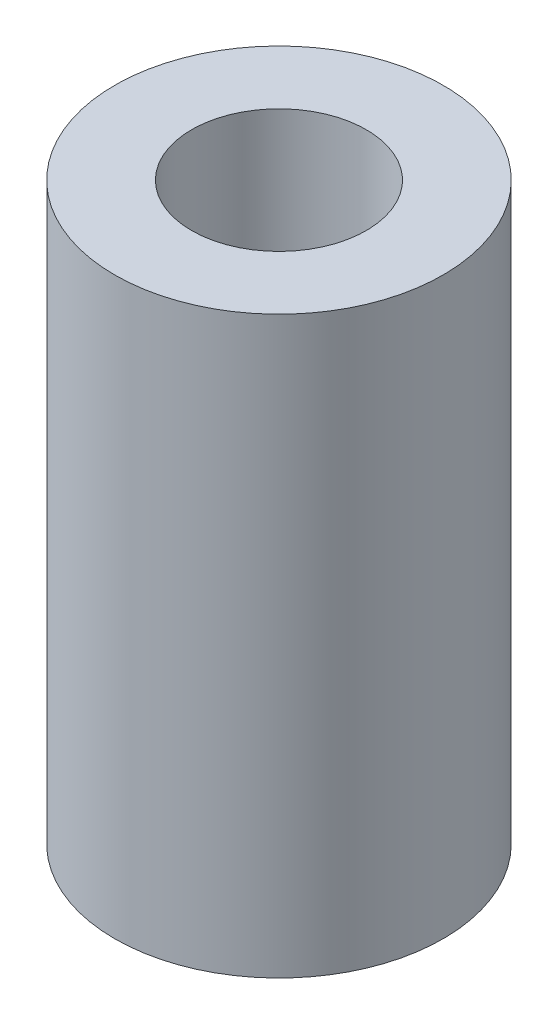
ISO-10303-21;
HEADER;
FILE_DESCRIPTION(('STEP AP214'),'2;1');
FILE_NAME('part.step','',(''),(''),'','','');
FILE_SCHEMA(('AUTOMOTIVE_DESIGN { 1 0 10303 214 1 1 1 1 }'));
ENDSEC;
DATA;
#1=APPLICATION_CONTEXT('core data for automotive mechanical design processes');
#2=APPLICATION_PROTOCOL_DEFINITION('international standard','automotive_design',2000,#1);
#3=PRODUCT_CONTEXT('',#1,'mechanical');
#4=PRODUCT('Part','Part','',(#3));
#5=PRODUCT_RELATED_PRODUCT_CATEGORY('part','',(#4));
#6=PRODUCT_DEFINITION_FORMATION('','',#4);
#7=PRODUCT_DEFINITION_CONTEXT('part definition',#1,'design');
#8=PRODUCT_DEFINITION('design','',#6,#7);
#9=PRODUCT_DEFINITION_SHAPE('','',#8);
#10=(LENGTH_UNIT() NAMED_UNIT(*) SI_UNIT(.MILLI.,.METRE.));
#11=(NAMED_UNIT(*) PLANE_ANGLE_UNIT() SI_UNIT($,.RADIAN.));
#12=(NAMED_UNIT(*) SI_UNIT($,.STERADIAN.) SOLID_ANGLE_UNIT());
#13=UNCERTAINTY_MEASURE_WITH_UNIT(LENGTH_MEASURE(1.E-05),#10,'distance_accuracy_value','');
#14=(GEOMETRIC_REPRESENTATION_CONTEXT(3) GLOBAL_UNCERTAINTY_ASSIGNED_CONTEXT((#13)) GLOBAL_UNIT_ASSIGNED_CONTEXT((#10,
#11,#12)) REPRESENTATION_CONTEXT('',''));
#15=CARTESIAN_POINT('',(0.,0.,0.));
#16=DIRECTION('',(0.,0.,1.));
#17=DIRECTION('',(1.,0.,0.));
#18=AXIS2_PLACEMENT_3D('',#15,#16,#17);
#19=CARTESIAN_POINT('',(0.,22.225,0.));
#20=DIRECTION('',(0.,1.,0.));
#21=DIRECTION('',(0.,0.,1.));
#22=AXIS2_PLACEMENT_3D('',#19,#20,#21);
#23=PLANE('',#22);
#24=CARTESIAN_POINT('',(0.,22.225,0.));
#25=DIRECTION('',(0.,1.,0.));
#26=DIRECTION('',(0.,0.,1.));
#27=AXIS2_PLACEMENT_3D('',#24,#25,#26);
#28=CIRCLE('',#27,6.35);
#29=CARTESIAN_POINT('',(0.,22.225,6.35));
#30=VERTEX_POINT('',#29);
#31=EDGE_CURVE('E10',#30,#30,#28,.T.);
#32=ORIENTED_EDGE('',*,*,#31,.T.);
#33=EDGE_LOOP('',(#32));
#34=FACE_BOUND('',#33,.T.);
#35=CARTESIAN_POINT('',(0.,22.225,0.));
#36=DIRECTION('',(0.,1.,0.));
#37=DIRECTION('',(0.,0.,1.));
#38=AXIS2_PLACEMENT_3D('',#35,#36,#37);
#39=CIRCLE('',#38,3.3782);
#40=CARTESIAN_POINT('',(0.,22.225,3.3782));
#41=VERTEX_POINT('',#40);
#42=EDGE_CURVE('E41',#41,#41,#39,.T.);
#43=ORIENTED_EDGE('',*,*,#42,.F.);
#44=EDGE_LOOP('',(#43));
#45=FACE_BOUND('',#44,.T.);
#46=ADVANCED_FACE('F30',(#34,#45),#23,.T.);
#47=CARTESIAN_POINT('',(0.,0.,0.));
#48=DIRECTION('',(0.,1.,0.));
#49=DIRECTION('',(0.,0.,1.));
#50=AXIS2_PLACEMENT_3D('',#47,#48,#49);
#51=PLANE('',#50);
#52=CARTESIAN_POINT('',(0.,0.,0.));
#53=DIRECTION('',(0.,1.,0.));
#54=DIRECTION('',(0.,0.,1.));
#55=AXIS2_PLACEMENT_3D('',#52,#53,#54);
#56=CIRCLE('',#55,6.35);
#57=CARTESIAN_POINT('',(0.,0.,6.35));
#58=VERTEX_POINT('',#57);
#59=EDGE_CURVE('E34',#58,#58,#56,.T.);
#60=ORIENTED_EDGE('',*,*,#59,.F.);
#61=EDGE_LOOP('',(#60));
#62=FACE_BOUND('',#61,.T.);
#63=CARTESIAN_POINT('',(0.,0.,0.));
#64=DIRECTION('',(0.,1.,0.));
#65=DIRECTION('',(0.,0.,1.));
#66=AXIS2_PLACEMENT_3D('',#63,#64,#65);
#67=CIRCLE('',#66,3.3782);
#68=CARTESIAN_POINT('',(0.,0.,3.3782));
#69=VERTEX_POINT('',#68);
#70=EDGE_CURVE('E43',#69,#69,#67,.T.);
#71=ORIENTED_EDGE('',*,*,#70,.T.);
#72=EDGE_LOOP('',(#71));
#73=FACE_BOUND('',#72,.T.);
#74=ADVANCED_FACE('F53',(#62,#73),#51,.F.);
#75=CARTESIAN_POINT('',(0.,22.225,0.));
#76=DIRECTION('',(0.,-1.,0.));
#77=DIRECTION('',(0.,0.,-1.));
#78=AXIS2_PLACEMENT_3D('',#75,#76,#77);
#79=CYLINDRICAL_SURFACE('',#78,6.35);
#80=ORIENTED_EDGE('',*,*,#31,.F.);
#81=EDGE_LOOP('',(#80));
#82=FACE_BOUND('',#81,.T.);
#83=ORIENTED_EDGE('',*,*,#59,.T.);
#84=EDGE_LOOP('',(#83));
#85=FACE_BOUND('',#84,.T.);
#86=ADVANCED_FACE('F32',(#82,#85),#79,.T.);
#87=CARTESIAN_POINT('',(0.,22.225,0.));
#88=DIRECTION('',(0.,-1.,0.));
#89=DIRECTION('',(0.,0.,-1.));
#90=AXIS2_PLACEMENT_3D('',#87,#88,#89);
#91=CYLINDRICAL_SURFACE('',#90,3.3782);
#92=ORIENTED_EDGE('',*,*,#42,.T.);
#93=EDGE_LOOP('',(#92));
#94=FACE_BOUND('',#93,.T.);
#95=ORIENTED_EDGE('',*,*,#70,.F.);
#96=EDGE_LOOP('',(#95));
#97=FACE_BOUND('',#96,.T.);
#98=ADVANCED_FACE('F49',(#94,#97),#91,.F.);
#99=CLOSED_SHELL('',(#46,#74,#86,#98));
#100=MANIFOLD_SOLID_BREP('B2',#99);
#101=ADVANCED_BREP_SHAPE_REPRESENTATION('',(#18,#100),#14);
#102=SHAPE_DEFINITION_REPRESENTATION(#9,#101);
ENDSEC;
END-ISO-10303-21;
